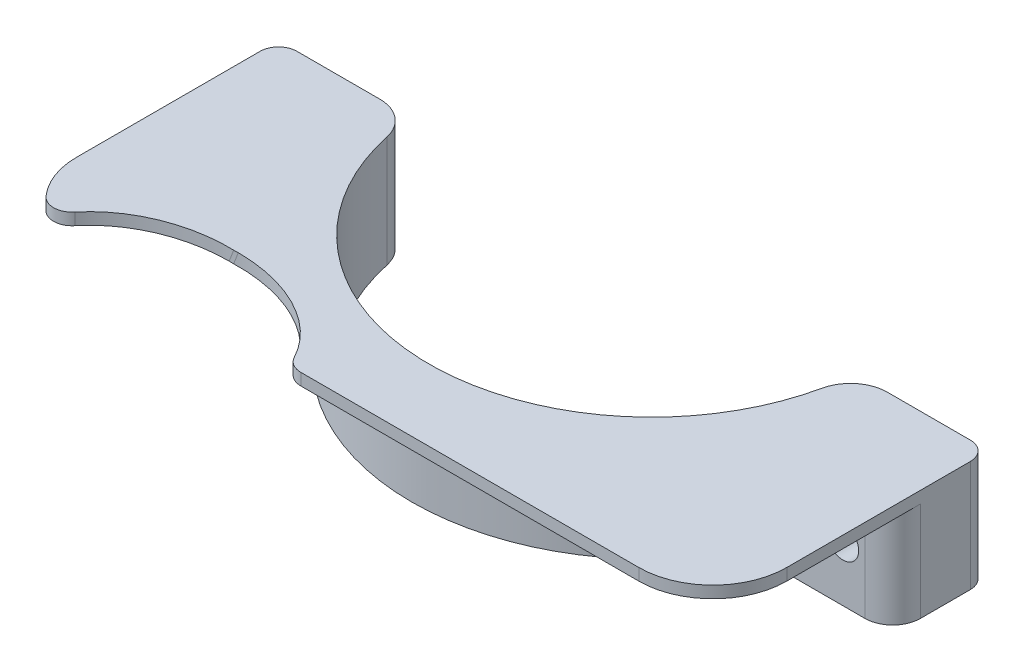
ISO-10303-21;
HEADER;
FILE_DESCRIPTION(('STEP AP214'),'2;1');
FILE_NAME('part.step','',(''),(''),'','','');
FILE_SCHEMA(('AUTOMOTIVE_DESIGN { 1 0 10303 214 1 1 1 1 }'));
ENDSEC;
DATA;
#1=APPLICATION_CONTEXT('core data for automotive mechanical design processes');
#2=APPLICATION_PROTOCOL_DEFINITION('international standard','automotive_design',2000,#1);
#3=PRODUCT_CONTEXT('',#1,'mechanical');
#4=PRODUCT('Part','Part','',(#3));
#5=PRODUCT_RELATED_PRODUCT_CATEGORY('part','',(#4));
#6=PRODUCT_DEFINITION_FORMATION('','',#4);
#7=PRODUCT_DEFINITION_CONTEXT('part definition',#1,'design');
#8=PRODUCT_DEFINITION('design','',#6,#7);
#9=PRODUCT_DEFINITION_SHAPE('','',#8);
#10=(LENGTH_UNIT() NAMED_UNIT(*) SI_UNIT(.MILLI.,.METRE.));
#11=(NAMED_UNIT(*) PLANE_ANGLE_UNIT() SI_UNIT($,.RADIAN.));
#12=(NAMED_UNIT(*) SI_UNIT($,.STERADIAN.) SOLID_ANGLE_UNIT());
#13=UNCERTAINTY_MEASURE_WITH_UNIT(LENGTH_MEASURE(1.E-05),#10,'distance_accuracy_value','');
#14=(GEOMETRIC_REPRESENTATION_CONTEXT(3) GLOBAL_UNCERTAINTY_ASSIGNED_CONTEXT((#13)) GLOBAL_UNIT_ASSIGNED_CONTEXT((#10,
#11,#12)) REPRESENTATION_CONTEXT('',''));
#15=CARTESIAN_POINT('',(0.,0.,0.));
#16=DIRECTION('',(0.,0.,1.));
#17=DIRECTION('',(1.,0.,0.));
#18=AXIS2_PLACEMENT_3D('',#15,#16,#17);
#19=CARTESIAN_POINT('',(1612.138,154.051600930678,-124.642988708345));
#20=DIRECTION('',(0.,0.,-1.));
#21=DIRECTION('',(-1.,0.,0.));
#22=AXIS2_PLACEMENT_3D('',#19,#20,#21);
#23=PLANE('',#22);
#24=DIRECTION('',(-1.,0.,0.));
#25=VECTOR('',#24,1.);
#26=CARTESIAN_POINT('',(1612.138,163.576600930678,-124.642988708345));
#27=LINE('',#26,#25);
#28=CARTESIAN_POINT('',(1605.788,163.576600930678,-124.642988708345));
#29=VERTEX_POINT('',#28);
#30=CARTESIAN_POINT('',(1576.78248811507,163.576600930678,-124.642988708345));
#31=VERTEX_POINT('',#30);
#32=EDGE_CURVE('E285',#29,#31,#27,.T.);
#33=ORIENTED_EDGE('',*,*,#32,.T.);
#34=DIRECTION('',(0.,-1.,0.));
#35=VECTOR('',#34,1.);
#36=CARTESIAN_POINT('',(1576.78248811507,154.051600930678,-124.642988708345));
#37=LINE('',#36,#35);
#38=CARTESIAN_POINT('',(1576.78248811507,162.560600930678,-124.642988708345));
#39=VERTEX_POINT('',#38);
#40=EDGE_CURVE('E219',#31,#39,#37,.T.);
#41=ORIENTED_EDGE('',*,*,#40,.T.);
#42=DIRECTION('',(-1.,0.,0.));
#43=VECTOR('',#42,1.);
#44=CARTESIAN_POINT('',(1581.658,162.560600930678,-124.642988708345));
#45=LINE('',#44,#43);
#46=CARTESIAN_POINT('',(1605.788,162.560600930678,-124.642988708345));
#47=VERTEX_POINT('',#46);
#48=EDGE_CURVE('E246',#47,#39,#45,.T.);
#49=ORIENTED_EDGE('',*,*,#48,.F.);
#50=DIRECTION('',(0.,1.,0.));
#51=VECTOR('',#50,1.);
#52=CARTESIAN_POINT('',(1605.788,163.576600930678,-124.642988708345));
#53=LINE('',#52,#51);
#54=EDGE_CURVE('E337',#47,#29,#53,.T.);
#55=ORIENTED_EDGE('',*,*,#54,.T.);
#56=EDGE_LOOP('',(#33,#41,#49,#55));
#57=FACE_BOUND('',#56,.T.);
#58=ADVANCED_FACE('F35',(#57),#23,.F.);
#59=CARTESIAN_POINT('',(1557.528,154.051600930678,-130.992988708345));
#60=DIRECTION('',(0.,-1.,0.));
#61=DIRECTION('',(0.,0.,-1.));
#62=AXIS2_PLACEMENT_3D('',#59,#60,#61);
#63=CYLINDRICAL_SURFACE('',#62,6.35);
#64=CARTESIAN_POINT('',(1557.528,162.560600930678,-130.992988708345));
#65=DIRECTION('',(0.,1.,0.));
#66=DIRECTION('',(0.,0.,1.));
#67=AXIS2_PLACEMENT_3D('',#64,#65,#66);
#68=CIRCLE('',#67,6.35);
#69=CARTESIAN_POINT('',(1552.74874703953,162.560600930678,-126.81193128948));
#70=VERTEX_POINT('',#69);
#71=CARTESIAN_POINT('',(1551.178,162.560600930678,-130.992988708345));
#72=VERTEX_POINT('',#71);
#73=EDGE_CURVE('E346',#70,#72,#68,.F.);
#74=ORIENTED_EDGE('',*,*,#73,.F.);
#75=DIRECTION('',(0.,-1.,0.));
#76=VECTOR('',#75,1.);
#77=CARTESIAN_POINT('',(1552.74874703953,154.051600930678,-126.81193128948));
#78=LINE('',#77,#76);
#79=CARTESIAN_POINT('',(1552.74874703953,163.576600930678,-126.81193128948));
#80=VERTEX_POINT('',#79);
#81=EDGE_CURVE('E12',#70,#80,#78,.F.);
#82=ORIENTED_EDGE('',*,*,#81,.T.);
#83=CARTESIAN_POINT('',(1557.528,163.576600930678,-130.992988708345));
#84=DIRECTION('',(0.,1.,0.));
#85=DIRECTION('',(0.,0.,1.));
#86=AXIS2_PLACEMENT_3D('',#83,#84,#85);
#87=CIRCLE('',#86,6.35);
#88=CARTESIAN_POINT('',(1551.178,163.576600930678,-130.992988708345));
#89=VERTEX_POINT('',#88);
#90=EDGE_CURVE('E340',#89,#80,#87,.T.);
#91=ORIENTED_EDGE('',*,*,#90,.F.);
#92=DIRECTION('',(0.,1.,0.));
#93=VECTOR('',#92,1.);
#94=CARTESIAN_POINT('',(1551.178,163.576600930678,-130.992988708345));
#95=LINE('',#94,#93);
#96=EDGE_CURVE('E350',#72,#89,#95,.T.);
#97=ORIENTED_EDGE('',*,*,#96,.F.);
#98=EDGE_LOOP('',(#74,#82,#91,#97));
#99=FACE_BOUND('',#98,.T.);
#100=ADVANCED_FACE('F503',(#99),#63,.T.);
#101=CARTESIAN_POINT('',(1551.178,154.051600930678,-148.336));
#102=DIRECTION('',(0.,0.,-1.));
#103=DIRECTION('',(-1.,0.,0.));
#104=AXIS2_PLACEMENT_3D('',#101,#102,#103);
#105=PLANE('',#104);
#106=CARTESIAN_POINT('',(1555.46425,158.814100930678,-148.336));
#107=DIRECTION('',(0.,0.,-1.));
#108=DIRECTION('',(1.,0.,0.));
#109=AXIS2_PLACEMENT_3D('',#106,#107,#108);
#110=CIRCLE('',#109,1.36525000000017);
#111=CARTESIAN_POINT('',(1556.8295,158.814100930678,-148.336));
#112=VERTEX_POINT('',#111);
#113=EDGE_CURVE('E224',#112,#112,#110,.T.);
#114=ORIENTED_EDGE('',*,*,#113,.F.);
#115=EDGE_LOOP('',(#114));
#116=FACE_BOUND('',#115,.T.);
#117=DIRECTION('',(-1.,0.,0.));
#118=VECTOR('',#117,1.);
#119=CARTESIAN_POINT('',(1551.178,163.576600930678,-148.336));
#120=LINE('',#119,#118);
#121=CARTESIAN_POINT('',(1559.88345833686,163.576600930678,-148.336));
#122=VERTEX_POINT('',#121);
#123=CARTESIAN_POINT('',(1552.7655,163.576600930678,-148.336));
#124=VERTEX_POINT('',#123);
#125=EDGE_CURVE('E262',#122,#124,#120,.T.);
#126=ORIENTED_EDGE('',*,*,#125,.F.);
#127=DIRECTION('',(0.,1.,0.));
#128=VECTOR('',#127,1.);
#129=CARTESIAN_POINT('',(1559.88345833686,154.051600930678,-148.336));
#130=LINE('',#129,#128);
#131=CARTESIAN_POINT('',(1559.88345833686,154.051600930678,-148.336));
#132=VERTEX_POINT('',#131);
#133=EDGE_CURVE('E328',#122,#132,#130,.F.);
#134=ORIENTED_EDGE('',*,*,#133,.T.);
#135=DIRECTION('',(-1.,0.,0.));
#136=VECTOR('',#135,1.);
#137=CARTESIAN_POINT('',(1551.178,154.051600930678,-148.336));
#138=LINE('',#137,#136);
#139=CARTESIAN_POINT('',(1552.7655,154.051600930678,-148.336));
#140=VERTEX_POINT('',#139);
#141=EDGE_CURVE('E271',#132,#140,#138,.T.);
#142=ORIENTED_EDGE('',*,*,#141,.T.);
#143=DIRECTION('',(0.,1.,0.));
#144=VECTOR('',#143,1.);
#145=CARTESIAN_POINT('',(1552.7655,154.051600930678,-148.336));
#146=LINE('',#145,#144);
#147=EDGE_CURVE('E299',#140,#124,#146,.T.);
#148=ORIENTED_EDGE('',*,*,#147,.T.);
#149=EDGE_LOOP('',(#126,#134,#142,#148));
#150=FACE_BOUND('',#149,.T.);
#151=ADVANCED_FACE('F490',(#116,#150),#105,.T.);
#152=CARTESIAN_POINT('',(1581.658,154.051600930678,-149.86));
#153=DIRECTION('',(0.,1.,0.));
#154=DIRECTION('',(0.,0.,1.));
#155=AXIS2_PLACEMENT_3D('',#152,#153,#154);
#156=CYLINDRICAL_SURFACE('',#155,19.1008000000002);
#157=CARTESIAN_POINT('',(1581.658,154.051600930678,-149.86));
#158=DIRECTION('',(0.,-1.,0.));
#159=DIRECTION('',(0.,0.,1.));
#160=AXIS2_PLACEMENT_3D('',#157,#158,#159);
#161=CIRCLE('',#160,19.1008000000002);
#162=CARTESIAN_POINT('',(1600.32898669405,154.051600930678,-145.830754846066));
#163=VERTEX_POINT('',#162);
#164=CARTESIAN_POINT('',(1562.98701330595,154.051600930678,-145.830754846066));
#165=VERTEX_POINT('',#164);
#166=EDGE_CURVE('E282',#163,#165,#161,.T.);
#167=ORIENTED_EDGE('',*,*,#166,.T.);
#168=DIRECTION('',(0.,1.,0.));
#169=VECTOR('',#168,1.);
#170=CARTESIAN_POINT('',(1562.98701330595,154.051600930678,-145.830754846066));
#171=LINE('',#170,#169);
#172=CARTESIAN_POINT('',(1562.98701330595,163.576600930678,-145.830754846066));
#173=VERTEX_POINT('',#172);
#174=EDGE_CURVE('E321',#165,#173,#171,.T.);
#175=ORIENTED_EDGE('',*,*,#174,.T.);
#176=CARTESIAN_POINT('',(1581.658,163.576600930678,-149.86));
#177=DIRECTION('',(0.,-1.,0.));
#178=DIRECTION('',(0.,0.,1.));
#179=AXIS2_PLACEMENT_3D('',#176,#177,#178);
#180=CIRCLE('',#179,19.1008000000002);
#181=CARTESIAN_POINT('',(1600.32898669405,163.576600930678,-145.830754846066));
#182=VERTEX_POINT('',#181);
#183=EDGE_CURVE('E274',#182,#173,#180,.T.);
#184=ORIENTED_EDGE('',*,*,#183,.F.);
#185=DIRECTION('',(0.,1.,0.));
#186=VECTOR('',#185,1.);
#187=CARTESIAN_POINT('',(1600.32898669405,154.051600930678,-145.830754846066));
#188=LINE('',#187,#186);
#189=EDGE_CURVE('E319',#182,#163,#188,.F.);
#190=ORIENTED_EDGE('',*,*,#189,.T.);
#191=EDGE_LOOP('',(#167,#175,#184,#190));
#192=FACE_BOUND('',#191,.T.);
#193=ADVANCED_FACE('F480',(#192),#156,.F.);
#194=CARTESIAN_POINT('',(1600.69790505859,154.051600930678,-148.336));
#195=DIRECTION('',(0.,0.,-1.));
#196=DIRECTION('',(-1.,0.,0.));
#197=AXIS2_PLACEMENT_3D('',#194,#195,#196);
#198=PLANE('',#197);
#199=CARTESIAN_POINT('',(1607.85175,158.814100930678,-148.336));
#200=DIRECTION('',(0.,0.,-1.));
#201=DIRECTION('',(-1.,0.,0.));
#202=AXIS2_PLACEMENT_3D('',#199,#200,#201);
#203=CIRCLE('',#202,1.36525000000017);
#204=CARTESIAN_POINT('',(1606.4865,158.814100930678,-148.336));
#205=VERTEX_POINT('',#204);
#206=EDGE_CURVE('E242',#205,#205,#203,.T.);
#207=ORIENTED_EDGE('',*,*,#206,.F.);
#208=EDGE_LOOP('',(#207));
#209=FACE_BOUND('',#208,.T.);
#210=DIRECTION('',(-1.,0.,0.));
#211=VECTOR('',#210,1.);
#212=CARTESIAN_POINT('',(1600.69790505859,154.051600930678,-148.336));
#213=LINE('',#212,#211);
#214=CARTESIAN_POINT('',(1610.5505,154.051600930678,-148.336));
#215=VERTEX_POINT('',#214);
#216=CARTESIAN_POINT('',(1603.43254166314,154.051600930678,-148.336));
#217=VERTEX_POINT('',#216);
#218=EDGE_CURVE('E279',#215,#217,#213,.T.);
#219=ORIENTED_EDGE('',*,*,#218,.T.);
#220=DIRECTION('',(0.,1.,0.));
#221=VECTOR('',#220,1.);
#222=CARTESIAN_POINT('',(1603.43254166314,154.051600930678,-148.336));
#223=LINE('',#222,#221);
#224=CARTESIAN_POINT('',(1603.43254166314,163.576600930678,-148.336));
#225=VERTEX_POINT('',#224);
#226=EDGE_CURVE('E334',#217,#225,#223,.T.);
#227=ORIENTED_EDGE('',*,*,#226,.T.);
#228=DIRECTION('',(-1.,0.,0.));
#229=VECTOR('',#228,1.);
#230=CARTESIAN_POINT('',(1600.69790505859,163.576600930678,-148.336));
#231=LINE('',#230,#229);
#232=CARTESIAN_POINT('',(1610.5505,163.576600930678,-148.336));
#233=VERTEX_POINT('',#232);
#234=EDGE_CURVE('E292',#233,#225,#231,.T.);
#235=ORIENTED_EDGE('',*,*,#234,.F.);
#236=DIRECTION('',(0.,1.,0.));
#237=VECTOR('',#236,1.);
#238=CARTESIAN_POINT('',(1610.5505,154.051600930678,-148.336));
#239=LINE('',#238,#237);
#240=EDGE_CURVE('E317',#233,#215,#239,.F.);
#241=ORIENTED_EDGE('',*,*,#240,.T.);
#242=EDGE_LOOP('',(#219,#227,#235,#241));
#243=FACE_BOUND('',#242,.T.);
#244=ADVANCED_FACE('F471',(#209,#243),#198,.T.);
#245=CARTESIAN_POINT('',(1612.138,154.051600930678,-148.336));
#246=DIRECTION('',(1.,0.,0.));
#247=DIRECTION('',(0.,0.,-1.));
#248=AXIS2_PLACEMENT_3D('',#245,#246,#247);
#249=PLANE('',#248);
#250=DIRECTION('',(0.,0.,1.));
#251=VECTOR('',#250,1.);
#252=CARTESIAN_POINT('',(1612.138,162.560600930678,-140.081));
#253=LINE('',#252,#251);
#254=CARTESIAN_POINT('',(1612.138,162.560600930678,-142.46225));
#255=VERTEX_POINT('',#254);
#256=CARTESIAN_POINT('',(1612.138,162.560600930678,-130.992988708345));
#257=VERTEX_POINT('',#256);
#258=EDGE_CURVE('E263',#255,#257,#253,.T.);
#259=ORIENTED_EDGE('',*,*,#258,.F.);
#260=DIRECTION('',(0.,-1.,0.));
#261=VECTOR('',#260,1.);
#262=CARTESIAN_POINT('',(1612.138,154.051600930678,-142.46225));
#263=LINE('',#262,#261);
#264=CARTESIAN_POINT('',(1612.138,154.051600930678,-142.46225));
#265=VERTEX_POINT('',#264);
#266=EDGE_CURVE('E387',#255,#265,#263,.T.);
#267=ORIENTED_EDGE('',*,*,#266,.T.);
#268=DIRECTION('',(0.,0.,-1.));
#269=VECTOR('',#268,1.);
#270=CARTESIAN_POINT('',(1612.138,154.051600930678,-148.336));
#271=LINE('',#270,#269);
#272=CARTESIAN_POINT('',(1612.138,154.051600930678,-146.7485));
#273=VERTEX_POINT('',#272);
#274=EDGE_CURVE('E277',#265,#273,#271,.T.);
#275=ORIENTED_EDGE('',*,*,#274,.T.);
#276=DIRECTION('',(0.,1.,0.));
#277=VECTOR('',#276,1.);
#278=CARTESIAN_POINT('',(1612.138,154.051600930678,-146.7485));
#279=LINE('',#278,#277);
#280=CARTESIAN_POINT('',(1612.138,163.576600930678,-146.7485));
#281=VERTEX_POINT('',#280);
#282=EDGE_CURVE('E314',#273,#281,#279,.T.);
#283=ORIENTED_EDGE('',*,*,#282,.T.);
#284=DIRECTION('',(0.,0.,-1.));
#285=VECTOR('',#284,1.);
#286=CARTESIAN_POINT('',(1612.138,163.576600930678,-148.336));
#287=LINE('',#286,#285);
#288=CARTESIAN_POINT('',(1612.138,163.576600930678,-130.992988708345));
#289=VERTEX_POINT('',#288);
#290=EDGE_CURVE('E290',#289,#281,#287,.T.);
#291=ORIENTED_EDGE('',*,*,#290,.F.);
#292=DIRECTION('',(0.,1.,0.));
#293=VECTOR('',#292,1.);
#294=CARTESIAN_POINT('',(1612.138,162.560600930678,-130.992988708345));
#295=LINE('',#294,#293);
#296=EDGE_CURVE('E344',#289,#257,#295,.F.);
#297=ORIENTED_EDGE('',*,*,#296,.T.);
#298=EDGE_LOOP('',(#259,#267,#275,#283,#291,#297));
#299=FACE_BOUND('',#298,.T.);
#300=ADVANCED_FACE('F462',(#299),#249,.T.);
#301=CARTESIAN_POINT('',(1551.178,154.051600930678,-148.336));
#302=DIRECTION('',(-1.,0.,0.));
#303=DIRECTION('',(0.,0.,1.));
#304=AXIS2_PLACEMENT_3D('',#301,#302,#303);
#305=PLANE('',#304);
#306=DIRECTION('',(0.,0.,1.));
#307=VECTOR('',#306,1.);
#308=CARTESIAN_POINT('',(1551.178,154.051600930678,-148.336));
#309=LINE('',#308,#307);
#310=CARTESIAN_POINT('',(1551.178,154.051600930678,-146.7485));
#311=VERTEX_POINT('',#310);
#312=CARTESIAN_POINT('',(1551.178,154.051600930678,-142.46225));
#313=VERTEX_POINT('',#312);
#314=EDGE_CURVE('E273',#311,#313,#309,.T.);
#315=ORIENTED_EDGE('',*,*,#314,.T.);
#316=DIRECTION('',(0.,-1.,0.));
#317=VECTOR('',#316,1.);
#318=CARTESIAN_POINT('',(1551.178,162.560600930678,-142.46225));
#319=LINE('',#318,#317);
#320=CARTESIAN_POINT('',(1551.178,162.560600930678,-142.46225));
#321=VERTEX_POINT('',#320);
#322=EDGE_CURVE('E384',#313,#321,#319,.F.);
#323=ORIENTED_EDGE('',*,*,#322,.T.);
#324=DIRECTION('',(0.,0.,-1.));
#325=VECTOR('',#324,1.);
#326=CARTESIAN_POINT('',(1551.178,162.560600930678,-119.761));
#327=LINE('',#326,#325);
#328=EDGE_CURVE('E260',#72,#321,#327,.T.);
#329=ORIENTED_EDGE('',*,*,#328,.F.);
#330=ORIENTED_EDGE('',*,*,#96,.T.);
#331=DIRECTION('',(0.,0.,1.));
#332=VECTOR('',#331,1.);
#333=CARTESIAN_POINT('',(1551.178,163.576600930678,-148.336));
#334=LINE('',#333,#332);
#335=CARTESIAN_POINT('',(1551.178,163.576600930678,-146.7485));
#336=VERTEX_POINT('',#335);
#337=EDGE_CURVE('E287',#336,#89,#334,.T.);
#338=ORIENTED_EDGE('',*,*,#337,.F.);
#339=DIRECTION('',(0.,1.,0.));
#340=VECTOR('',#339,1.);
#341=CARTESIAN_POINT('',(1551.178,154.051600930678,-146.7485));
#342=LINE('',#341,#340);
#343=EDGE_CURVE('E306',#336,#311,#342,.F.);
#344=ORIENTED_EDGE('',*,*,#343,.T.);
#345=EDGE_LOOP('',(#315,#323,#329,#330,#338,#344));
#346=FACE_BOUND('',#345,.T.);
#347=ADVANCED_FACE('F499',(#346),#305,.T.);
#348=CARTESIAN_POINT('',(1581.658,154.051600930678,-149.86));
#349=DIRECTION('',(0.,1.,0.));
#350=DIRECTION('',(0.,0.,1.));
#351=AXIS2_PLACEMENT_3D('',#348,#349,#350);
#352=PLANE('',#351);
#353=DIRECTION('',(1.,0.,0.));
#354=VECTOR('',#353,1.);
#355=CARTESIAN_POINT('',(1563.55660129714,154.051600930678,-140.081));
#356=LINE('',#355,#354);
#357=CARTESIAN_POINT('',(1553.55925,154.051600930678,-140.081));
#358=VERTEX_POINT('',#357);
#359=CARTESIAN_POINT('',(1561.7530035167,154.051600930678,-140.081));
#360=VERTEX_POINT('',#359);
#361=EDGE_CURVE('E249',#358,#360,#356,.T.);
#362=ORIENTED_EDGE('',*,*,#361,.F.);
#363=CARTESIAN_POINT('',(1553.55925,154.051600930678,-142.46225));
#364=DIRECTION('',(0.,1.,0.));
#365=DIRECTION('',(0.,0.,1.));
#366=AXIS2_PLACEMENT_3D('',#363,#364,#365);
#367=CIRCLE('',#366,2.38125);
#368=EDGE_CURVE('E382',#358,#313,#367,.F.);
#369=ORIENTED_EDGE('',*,*,#368,.T.);
#370=ORIENTED_EDGE('',*,*,#314,.F.);
#371=CARTESIAN_POINT('',(1552.7655,154.051600930678,-146.7485));
#372=DIRECTION('',(0.,1.,0.));
#373=DIRECTION('',(0.,0.,1.));
#374=AXIS2_PLACEMENT_3D('',#371,#372,#373);
#375=CIRCLE('',#374,1.5875);
#376=EDGE_CURVE('E311',#311,#140,#375,.F.);
#377=ORIENTED_EDGE('',*,*,#376,.T.);
#378=ORIENTED_EDGE('',*,*,#141,.F.);
#379=CARTESIAN_POINT('',(1559.88345833686,154.051600930678,-145.161));
#380=DIRECTION('',(0.,1.,0.));
#381=DIRECTION('',(0.,0.,1.));
#382=AXIS2_PLACEMENT_3D('',#379,#380,#381);
#383=CIRCLE('',#382,3.175);
#384=EDGE_CURVE('E332',#132,#165,#383,.F.);
#385=ORIENTED_EDGE('',*,*,#384,.T.);
#386=ORIENTED_EDGE('',*,*,#166,.F.);
#387=CARTESIAN_POINT('',(1603.43254166314,154.051600930678,-145.161));
#388=DIRECTION('',(0.,1.,0.));
#389=DIRECTION('',(0.,0.,1.));
#390=AXIS2_PLACEMENT_3D('',#387,#388,#389);
#391=CIRCLE('',#390,3.175);
#392=EDGE_CURVE('E330',#163,#217,#391,.F.);
#393=ORIENTED_EDGE('',*,*,#392,.T.);
#394=ORIENTED_EDGE('',*,*,#218,.F.);
#395=CARTESIAN_POINT('',(1610.5505,154.051600930678,-146.7485));
#396=DIRECTION('',(0.,1.,0.));
#397=DIRECTION('',(0.,0.,1.));
#398=AXIS2_PLACEMENT_3D('',#395,#396,#397);
#399=CIRCLE('',#398,1.5875);
#400=EDGE_CURVE('E308',#215,#273,#399,.F.);
#401=ORIENTED_EDGE('',*,*,#400,.T.);
#402=ORIENTED_EDGE('',*,*,#274,.F.);
#403=CARTESIAN_POINT('',(1609.75675,154.051600930678,-142.46225));
#404=DIRECTION('',(0.,1.,0.));
#405=DIRECTION('',(0.,0.,1.));
#406=AXIS2_PLACEMENT_3D('',#403,#404,#405);
#407=CIRCLE('',#406,2.38125);
#408=CARTESIAN_POINT('',(1609.75675,154.051600930678,-140.081));
#409=VERTEX_POINT('',#408);
#410=EDGE_CURVE('E380',#265,#409,#407,.F.);
#411=ORIENTED_EDGE('',*,*,#410,.T.);
#412=DIRECTION('',(1.,0.,0.));
#413=VECTOR('',#412,1.);
#414=CARTESIAN_POINT('',(1612.138,154.051600930678,-140.081));
#415=LINE('',#414,#413);
#416=CARTESIAN_POINT('',(1601.5629964833,154.051600930678,-140.081));
#417=VERTEX_POINT('',#416);
#418=EDGE_CURVE('E250',#417,#409,#415,.T.);
#419=ORIENTED_EDGE('',*,*,#418,.F.);
#420=CARTESIAN_POINT('',(1601.5629964833,154.051600930678,-136.906));
#421=DIRECTION('',(0.,1.,0.));
#422=DIRECTION('',(0.,0.,1.));
#423=AXIS2_PLACEMENT_3D('',#420,#421,#422);
#424=CIRCLE('',#423,3.175);
#425=CARTESIAN_POINT('',(1598.90190069676,154.051600930678,-138.637818181818));
#426=VERTEX_POINT('',#425);
#427=EDGE_CURVE('E371',#417,#426,#424,.T.);
#428=ORIENTED_EDGE('',*,*,#427,.T.);
#429=CARTESIAN_POINT('',(1581.658,154.051600930678,-149.86));
#430=DIRECTION('',(0.,1.,0.));
#431=DIRECTION('',(0.,0.,-1.));
#432=AXIS2_PLACEMENT_3D('',#429,#430,#431);
#433=CIRCLE('',#432,20.5740000000002);
#434=CARTESIAN_POINT('',(1564.41409930324,154.051600930678,-138.637818181818));
#435=VERTEX_POINT('',#434);
#436=EDGE_CURVE('E254',#435,#426,#433,.T.);
#437=ORIENTED_EDGE('',*,*,#436,.F.);
#438=CARTESIAN_POINT('',(1561.7530035167,154.051600930678,-136.906));
#439=DIRECTION('',(0.,1.,0.));
#440=DIRECTION('',(0.,0.,1.));
#441=AXIS2_PLACEMENT_3D('',#438,#439,#440);
#442=CIRCLE('',#441,3.175);
#443=EDGE_CURVE('E368',#435,#360,#442,.T.);
#444=ORIENTED_EDGE('',*,*,#443,.T.);
#445=EDGE_LOOP('',(#362,#369,#370,#377,#378,#385,#386,#393,#394,#401,#402,#411,#419,#428,#437,#444));
#446=FACE_BOUND('',#445,.T.);
#447=ADVANCED_FACE('F530',(#446),#352,.F.);
#448=CARTESIAN_POINT('',(1581.658,163.576600930678,-149.86));
#449=DIRECTION('',(0.,1.,0.));
#450=DIRECTION('',(0.,0.,1.));
#451=AXIS2_PLACEMENT_3D('',#448,#449,#450);
#452=PLANE('',#451);
#453=CARTESIAN_POINT('',(1565.21348870192,163.576600930678,-122.115720618094));
#454=DIRECTION('',(0.,1.,0.));
#455=DIRECTION('',(-1.,0.,0.));
#456=AXIS2_PLACEMENT_3D('',#453,#454,#455);
#457=ELLIPSE('',#456,11.0210462503366,8.73124999999996);
#458=CARTESIAN_POINT('',(1565.21348870192,163.576600930678,-130.846970618094));
#459=VERTEX_POINT('',#458);
#460=CARTESIAN_POINT('',(1575.37902625167,163.576600930678,-125.488564825466));
#461=VERTEX_POINT('',#460);
#462=EDGE_CURVE('E225',#459,#461,#457,.F.);
#463=ORIENTED_EDGE('',*,*,#462,.T.);
#464=CARTESIAN_POINT('',(1576.78248811507,163.576600930678,-126.230488708345));
#465=DIRECTION('',(0.,1.,0.));
#466=DIRECTION('',(0.,0.,1.));
#467=AXIS2_PLACEMENT_3D('',#464,#465,#466);
#468=CIRCLE('',#467,1.5875);
#469=EDGE_CURVE('E443',#461,#31,#468,.T.);
#470=ORIENTED_EDGE('',*,*,#469,.T.);
#471=ORIENTED_EDGE('',*,*,#32,.F.);
#472=CARTESIAN_POINT('',(1605.788,163.576600930678,-130.992988708345));
#473=DIRECTION('',(0.,1.,0.));
#474=DIRECTION('',(0.,0.,1.));
#475=AXIS2_PLACEMENT_3D('',#472,#473,#474);
#476=CIRCLE('',#475,6.35);
#477=EDGE_CURVE('E342',#29,#289,#476,.T.);
#478=ORIENTED_EDGE('',*,*,#477,.T.);
#479=ORIENTED_EDGE('',*,*,#290,.T.);
#480=CARTESIAN_POINT('',(1610.5505,163.576600930678,-146.7485));
#481=DIRECTION('',(0.,1.,0.));
#482=DIRECTION('',(0.,0.,1.));
#483=AXIS2_PLACEMENT_3D('',#480,#481,#482);
#484=CIRCLE('',#483,1.5875);
#485=EDGE_CURVE('E302',#281,#233,#484,.T.);
#486=ORIENTED_EDGE('',*,*,#485,.T.);
#487=ORIENTED_EDGE('',*,*,#234,.T.);
#488=CARTESIAN_POINT('',(1603.43254166314,163.576600930678,-145.161));
#489=DIRECTION('',(0.,1.,0.));
#490=DIRECTION('',(0.,0.,1.));
#491=AXIS2_PLACEMENT_3D('',#488,#489,#490);
#492=CIRCLE('',#491,3.175);
#493=EDGE_CURVE('E324',#225,#182,#492,.T.);
#494=ORIENTED_EDGE('',*,*,#493,.T.);
#495=ORIENTED_EDGE('',*,*,#183,.T.);
#496=CARTESIAN_POINT('',(1559.88345833686,163.576600930678,-145.161));
#497=DIRECTION('',(0.,1.,0.));
#498=DIRECTION('',(0.,0.,1.));
#499=AXIS2_PLACEMENT_3D('',#496,#497,#498);
#500=CIRCLE('',#499,3.175);
#501=EDGE_CURVE('E326',#173,#122,#500,.T.);
#502=ORIENTED_EDGE('',*,*,#501,.T.);
#503=ORIENTED_EDGE('',*,*,#125,.T.);
#504=CARTESIAN_POINT('',(1552.7655,163.576600930678,-146.7485));
#505=DIRECTION('',(0.,1.,0.));
#506=DIRECTION('',(0.,0.,1.));
#507=AXIS2_PLACEMENT_3D('',#504,#505,#506);
#508=CIRCLE('',#507,1.5875);
#509=EDGE_CURVE('E304',#124,#336,#508,.T.);
#510=ORIENTED_EDGE('',*,*,#509,.T.);
#511=ORIENTED_EDGE('',*,*,#337,.T.);
#512=ORIENTED_EDGE('',*,*,#90,.T.);
#513=CARTESIAN_POINT('',(1553.94356027965,163.576600930678,-127.857195644196));
#514=DIRECTION('',(0.,1.,0.));
#515=DIRECTION('',(0.,0.,1.));
#516=AXIS2_PLACEMENT_3D('',#513,#514,#515);
#517=CIRCLE('',#516,1.5875);
#518=CARTESIAN_POINT('',(1555.1738262858,163.576600930678,-126.853900172212));
#519=VERTEX_POINT('',#518);
#520=EDGE_CURVE('E55',#80,#519,#517,.T.);
#521=ORIENTED_EDGE('',*,*,#520,.T.);
#522=CARTESIAN_POINT('',(1564.43091635106,163.576600930678,-122.115720618094));
#523=DIRECTION('',(0.,-1.,0.));
#524=DIRECTION('',(-1.,0.,0.));
#525=AXIS2_PLACEMENT_3D('',#522,#523,#524);
#526=ELLIPSE('',#525,11.0210462503366,8.73124999999997);
#527=CARTESIAN_POINT('',(1564.82220252649,163.576600930678,-130.841466006151));
#528=VERTEX_POINT('',#527);
#529=EDGE_CURVE('E199',#519,#528,#526,.T.);
#530=ORIENTED_EDGE('',*,*,#529,.T.);
#531=EDGE_CURVE('E204',#528,#459,#457,.F.);
#532=ORIENTED_EDGE('',*,*,#531,.T.);
#533=EDGE_LOOP('',(#463,#470,#471,#478,#479,#486,#487,#494,#495,#502,#503,#510,#511,#512,#521,
#530,#532));
#534=FACE_BOUND('',#533,.T.);
#535=ADVANCED_FACE('F202',(#534),#452,.T.);
#536=CARTESIAN_POINT('',(1581.658,162.560600930678,-149.86));
#537=DIRECTION('',(0.,1.,0.));
#538=DIRECTION('',(0.,0.,1.));
#539=AXIS2_PLACEMENT_3D('',#536,#537,#538);
#540=PLANE('',#539);
#541=ORIENTED_EDGE('',*,*,#48,.T.);
#542=CARTESIAN_POINT('',(1576.78248811507,162.560600930678,-126.230488708345));
#543=DIRECTION('',(0.,1.,0.));
#544=DIRECTION('',(0.,0.,1.));
#545=AXIS2_PLACEMENT_3D('',#542,#543,#544);
#546=CIRCLE('',#545,1.5875);
#547=CARTESIAN_POINT('',(1575.37902625167,162.560600930678,-125.488564825466));
#548=VERTEX_POINT('',#547);
#549=EDGE_CURVE('E435',#39,#548,#546,.F.);
#550=ORIENTED_EDGE('',*,*,#549,.T.);
#551=CARTESIAN_POINT('',(1565.21348870192,162.560600930678,-122.115720618094));
#552=DIRECTION('',(0.,-1.,0.));
#553=DIRECTION('',(-1.,0.,0.));
#554=AXIS2_PLACEMENT_3D('',#551,#552,#553);
#555=ELLIPSE('',#554,11.0210462503366,8.73124999999997);
#556=CARTESIAN_POINT('',(1564.82220252649,162.560600930678,-130.841466006151));
#557=VERTEX_POINT('',#556);
#558=EDGE_CURVE('E209',#557,#548,#555,.T.);
#559=ORIENTED_EDGE('',*,*,#558,.F.);
#560=CARTESIAN_POINT('',(1564.43091635106,162.560600930678,-122.115720618094));
#561=DIRECTION('',(0.,1.,0.));
#562=DIRECTION('',(-1.,0.,0.));
#563=AXIS2_PLACEMENT_3D('',#560,#561,#562);
#564=ELLIPSE('',#563,11.0210462503366,8.73124999999996);
#565=CARTESIAN_POINT('',(1564.43091635106,162.560600930678,-130.846970618094));
#566=VERTEX_POINT('',#565);
#567=EDGE_CURVE('E208',#566,#557,#564,.F.);
#568=ORIENTED_EDGE('',*,*,#567,.F.);
#569=CARTESIAN_POINT('',(1555.1738262858,162.560600930678,-126.853900172212));
#570=VERTEX_POINT('',#569);
#571=EDGE_CURVE('E215',#570,#566,#564,.F.);
#572=ORIENTED_EDGE('',*,*,#571,.F.);
#573=CARTESIAN_POINT('',(1553.94356027965,162.560600930678,-127.857195644196));
#574=DIRECTION('',(0.,1.,0.));
#575=DIRECTION('',(0.,0.,1.));
#576=AXIS2_PLACEMENT_3D('',#573,#574,#575);
#577=CIRCLE('',#576,1.5875);
#578=EDGE_CURVE('E432',#570,#70,#577,.F.);
#579=ORIENTED_EDGE('',*,*,#578,.T.);
#580=ORIENTED_EDGE('',*,*,#73,.T.);
#581=ORIENTED_EDGE('',*,*,#328,.T.);
#582=CARTESIAN_POINT('',(1553.55925,162.560600930678,-142.46225));
#583=DIRECTION('',(0.,1.,0.));
#584=DIRECTION('',(0.,0.,1.));
#585=AXIS2_PLACEMENT_3D('',#582,#583,#584);
#586=CIRCLE('',#585,2.38125);
#587=CARTESIAN_POINT('',(1553.55925,162.560600930678,-140.081));
#588=VERTEX_POINT('',#587);
#589=EDGE_CURVE('E391',#321,#588,#586,.T.);
#590=ORIENTED_EDGE('',*,*,#589,.T.);
#591=DIRECTION('',(1.,0.,0.));
#592=VECTOR('',#591,1.);
#593=CARTESIAN_POINT('',(1563.55660129714,162.560600930678,-140.081));
#594=LINE('',#593,#592);
#595=CARTESIAN_POINT('',(1561.7530035167,162.560600930678,-140.081));
#596=VERTEX_POINT('',#595);
#597=EDGE_CURVE('E253',#588,#596,#594,.T.);
#598=ORIENTED_EDGE('',*,*,#597,.T.);
#599=CARTESIAN_POINT('',(1561.7530035167,162.560600930678,-136.906));
#600=DIRECTION('',(0.,1.,0.));
#601=DIRECTION('',(0.,0.,1.));
#602=AXIS2_PLACEMENT_3D('',#599,#600,#601);
#603=CIRCLE('',#602,3.175);
#604=CARTESIAN_POINT('',(1564.41409930324,162.560600930678,-138.637818181818));
#605=VERTEX_POINT('',#604);
#606=EDGE_CURVE('E363',#596,#605,#603,.F.);
#607=ORIENTED_EDGE('',*,*,#606,.T.);
#608=CARTESIAN_POINT('',(1581.658,162.560600930678,-149.86));
#609=DIRECTION('',(0.,1.,0.));
#610=DIRECTION('',(0.,0.,1.));
#611=AXIS2_PLACEMENT_3D('',#608,#609,#610);
#612=CIRCLE('',#611,20.5740000000002);
#613=CARTESIAN_POINT('',(1598.90190069676,162.560600930678,-138.637818181818));
#614=VERTEX_POINT('',#613);
#615=EDGE_CURVE('E259',#605,#614,#612,.T.);
#616=ORIENTED_EDGE('',*,*,#615,.T.);
#617=CARTESIAN_POINT('',(1601.5629964833,162.560600930678,-136.906));
#618=DIRECTION('',(0.,1.,0.));
#619=DIRECTION('',(0.,0.,1.));
#620=AXIS2_PLACEMENT_3D('',#617,#618,#619);
#621=CIRCLE('',#620,3.175);
#622=CARTESIAN_POINT('',(1601.5629964833,162.560600930678,-140.081));
#623=VERTEX_POINT('',#622);
#624=EDGE_CURVE('E361',#614,#623,#621,.F.);
#625=ORIENTED_EDGE('',*,*,#624,.T.);
#626=DIRECTION('',(1.,0.,0.));
#627=VECTOR('',#626,1.);
#628=CARTESIAN_POINT('',(1612.138,162.560600930678,-140.081));
#629=LINE('',#628,#627);
#630=CARTESIAN_POINT('',(1609.75675,162.560600930678,-140.081));
#631=VERTEX_POINT('',#630);
#632=EDGE_CURVE('E266',#623,#631,#629,.T.);
#633=ORIENTED_EDGE('',*,*,#632,.T.);
#634=CARTESIAN_POINT('',(1609.75675,162.560600930678,-142.46225));
#635=DIRECTION('',(0.,1.,0.));
#636=DIRECTION('',(0.,0.,1.));
#637=AXIS2_PLACEMENT_3D('',#634,#635,#636);
#638=CIRCLE('',#637,2.38125);
#639=EDGE_CURVE('E233',#631,#255,#638,.T.);
#640=ORIENTED_EDGE('',*,*,#639,.T.);
#641=ORIENTED_EDGE('',*,*,#258,.T.);
#642=CARTESIAN_POINT('',(1605.788,162.560600930678,-130.992988708345));
#643=DIRECTION('',(0.,1.,0.));
#644=DIRECTION('',(0.,0.,1.));
#645=AXIS2_PLACEMENT_3D('',#642,#643,#644);
#646=CIRCLE('',#645,6.35);
#647=EDGE_CURVE('E348',#257,#47,#646,.F.);
#648=ORIENTED_EDGE('',*,*,#647,.T.);
#649=EDGE_LOOP('',(#541,#550,#559,#568,#572,#579,#580,#581,#590,#598,#607,#616,#625,#633,#640,
#641,#648));
#650=FACE_BOUND('',#649,.T.);
#651=ADVANCED_FACE('F445',(#650),#540,.F.);
#652=CARTESIAN_POINT('',(1563.55660129714,227.834082985299,-140.081));
#653=DIRECTION('',(0.,0.,-1.));
#654=DIRECTION('',(-1.,0.,0.));
#655=AXIS2_PLACEMENT_3D('',#652,#653,#654);
#656=PLANE('',#655);
#657=CARTESIAN_POINT('',(1555.46425,158.814100930678,-140.081));
#658=DIRECTION('',(0.,0.,-1.));
#659=DIRECTION('',(-1.,0.,0.));
#660=AXIS2_PLACEMENT_3D('',#657,#658,#659);
#661=CIRCLE('',#660,1.36525000000017);
#662=CARTESIAN_POINT('',(1554.099,158.814100930678,-140.081));
#663=VERTEX_POINT('',#662);
#664=EDGE_CURVE('E228',#663,#663,#661,.T.);
#665=ORIENTED_EDGE('',*,*,#664,.T.);
#666=EDGE_LOOP('',(#665));
#667=FACE_BOUND('',#666,.T.);
#668=ORIENTED_EDGE('',*,*,#597,.F.);
#669=DIRECTION('',(0.,-1.,0.));
#670=VECTOR('',#669,1.);
#671=CARTESIAN_POINT('',(1553.55925,154.051600930678,-140.081));
#672=LINE('',#671,#670);
#673=EDGE_CURVE('E373',#588,#358,#672,.T.);
#674=ORIENTED_EDGE('',*,*,#673,.T.);
#675=ORIENTED_EDGE('',*,*,#361,.T.);
#676=DIRECTION('',(0.,1.,0.));
#677=VECTOR('',#676,1.);
#678=CARTESIAN_POINT('',(1561.7530035167,162.560600930678,-140.081));
#679=LINE('',#678,#677);
#680=EDGE_CURVE('E358',#360,#596,#679,.T.);
#681=ORIENTED_EDGE('',*,*,#680,.T.);
#682=EDGE_LOOP('',(#668,#674,#675,#681));
#683=FACE_BOUND('',#682,.T.);
#684=ADVANCED_FACE('F523',(#667,#683),#656,.F.);
#685=CARTESIAN_POINT('',(1581.658,227.834082985299,-149.86));
#686=DIRECTION('',(0.,-1.,0.));
#687=DIRECTION('',(0.,0.,-1.));
#688=AXIS2_PLACEMENT_3D('',#685,#686,#687);
#689=CYLINDRICAL_SURFACE('',#688,20.5740000000002);
#690=ORIENTED_EDGE('',*,*,#615,.F.);
#691=DIRECTION('',(0.,-1.,0.));
#692=VECTOR('',#691,1.);
#693=CARTESIAN_POINT('',(1564.41409930324,227.834082985299,-138.637818181818));
#694=LINE('',#693,#692);
#695=EDGE_CURVE('E355',#605,#435,#694,.T.);
#696=ORIENTED_EDGE('',*,*,#695,.T.);
#697=ORIENTED_EDGE('',*,*,#436,.T.);
#698=DIRECTION('',(0.,-1.,0.));
#699=VECTOR('',#698,1.);
#700=CARTESIAN_POINT('',(1598.90190069676,227.834082985299,-138.637818181818));
#701=LINE('',#700,#699);
#702=EDGE_CURVE('E353',#426,#614,#701,.F.);
#703=ORIENTED_EDGE('',*,*,#702,.T.);
#704=EDGE_LOOP('',(#690,#696,#697,#703));
#705=FACE_BOUND('',#704,.T.);
#706=ADVANCED_FACE('F519',(#705),#689,.T.);
#707=CARTESIAN_POINT('',(1612.138,227.834082985299,-140.081));
#708=DIRECTION('',(0.,0.,-1.));
#709=DIRECTION('',(-1.,0.,0.));
#710=AXIS2_PLACEMENT_3D('',#707,#708,#709);
#711=PLANE('',#710);
#712=CARTESIAN_POINT('',(1607.85175,158.814100930678,-140.081));
#713=DIRECTION('',(0.,0.,-1.));
#714=DIRECTION('',(-1.,0.,0.));
#715=AXIS2_PLACEMENT_3D('',#712,#713,#714);
#716=CIRCLE('',#715,1.36525000000017);
#717=CARTESIAN_POINT('',(1606.4865,158.814100930678,-140.081));
#718=VERTEX_POINT('',#717);
#719=EDGE_CURVE('E245',#718,#718,#716,.T.);
#720=ORIENTED_EDGE('',*,*,#719,.T.);
#721=EDGE_LOOP('',(#720));
#722=FACE_BOUND('',#721,.T.);
#723=ORIENTED_EDGE('',*,*,#418,.T.);
#724=DIRECTION('',(0.,-1.,0.));
#725=VECTOR('',#724,1.);
#726=CARTESIAN_POINT('',(1609.75675,162.560600930678,-140.081));
#727=LINE('',#726,#725);
#728=EDGE_CURVE('E390',#409,#631,#727,.F.);
#729=ORIENTED_EDGE('',*,*,#728,.T.);
#730=ORIENTED_EDGE('',*,*,#632,.F.);
#731=DIRECTION('',(0.,1.,0.));
#732=VECTOR('',#731,1.);
#733=CARTESIAN_POINT('',(1601.5629964833,154.051600930678,-140.081));
#734=LINE('',#733,#732);
#735=EDGE_CURVE('E365',#623,#417,#734,.F.);
#736=ORIENTED_EDGE('',*,*,#735,.T.);
#737=EDGE_LOOP('',(#723,#729,#730,#736));
#738=FACE_BOUND('',#737,.T.);
#739=ADVANCED_FACE('F516',(#722,#738),#711,.F.);
#740=CARTESIAN_POINT('',(1552.7655,154.051600930678,-146.7485));
#741=DIRECTION('',(0.,1.,0.));
#742=DIRECTION('',(0.,0.,1.));
#743=AXIS2_PLACEMENT_3D('',#740,#741,#742);
#744=CYLINDRICAL_SURFACE('',#743,1.5875);
#745=ORIENTED_EDGE('',*,*,#376,.F.);
#746=ORIENTED_EDGE('',*,*,#343,.F.);
#747=ORIENTED_EDGE('',*,*,#509,.F.);
#748=ORIENTED_EDGE('',*,*,#147,.F.);
#749=EDGE_LOOP('',(#745,#746,#747,#748));
#750=FACE_BOUND('',#749,.T.);
#751=ADVANCED_FACE('F495',(#750),#744,.T.);
#752=CARTESIAN_POINT('',(1610.5505,154.051600930678,-146.7485));
#753=DIRECTION('',(0.,1.,0.));
#754=DIRECTION('',(0.,0.,1.));
#755=AXIS2_PLACEMENT_3D('',#752,#753,#754);
#756=CYLINDRICAL_SURFACE('',#755,1.5875);
#757=ORIENTED_EDGE('',*,*,#400,.F.);
#758=ORIENTED_EDGE('',*,*,#240,.F.);
#759=ORIENTED_EDGE('',*,*,#485,.F.);
#760=ORIENTED_EDGE('',*,*,#282,.F.);
#761=EDGE_LOOP('',(#757,#758,#759,#760));
#762=FACE_BOUND('',#761,.T.);
#763=ADVANCED_FACE('F467',(#762),#756,.T.);
#764=CARTESIAN_POINT('',(1559.88345833686,154.051600930678,-145.161));
#765=DIRECTION('',(0.,1.,0.));
#766=DIRECTION('',(0.,0.,1.));
#767=AXIS2_PLACEMENT_3D('',#764,#765,#766);
#768=CYLINDRICAL_SURFACE('',#767,3.175);
#769=ORIENTED_EDGE('',*,*,#384,.F.);
#770=ORIENTED_EDGE('',*,*,#133,.F.);
#771=ORIENTED_EDGE('',*,*,#501,.F.);
#772=ORIENTED_EDGE('',*,*,#174,.F.);
#773=EDGE_LOOP('',(#769,#770,#771,#772));
#774=FACE_BOUND('',#773,.T.);
#775=ADVANCED_FACE('F485',(#774),#768,.T.);
#776=CARTESIAN_POINT('',(1603.43254166314,154.051600930678,-145.161));
#777=DIRECTION('',(0.,1.,0.));
#778=DIRECTION('',(0.,0.,1.));
#779=AXIS2_PLACEMENT_3D('',#776,#777,#778);
#780=CYLINDRICAL_SURFACE('',#779,3.175);
#781=ORIENTED_EDGE('',*,*,#392,.F.);
#782=ORIENTED_EDGE('',*,*,#189,.F.);
#783=ORIENTED_EDGE('',*,*,#493,.F.);
#784=ORIENTED_EDGE('',*,*,#226,.F.);
#785=EDGE_LOOP('',(#781,#782,#783,#784));
#786=FACE_BOUND('',#785,.T.);
#787=ADVANCED_FACE('F476',(#786),#780,.T.);
#788=CARTESIAN_POINT('',(1605.788,154.051600930678,-130.992988708345));
#789=DIRECTION('',(0.,-1.,0.));
#790=DIRECTION('',(0.,0.,-1.));
#791=AXIS2_PLACEMENT_3D('',#788,#789,#790);
#792=CYLINDRICAL_SURFACE('',#791,6.35);
#793=ORIENTED_EDGE('',*,*,#647,.F.);
#794=ORIENTED_EDGE('',*,*,#296,.F.);
#795=ORIENTED_EDGE('',*,*,#477,.F.);
#796=ORIENTED_EDGE('',*,*,#54,.F.);
#797=EDGE_LOOP('',(#793,#794,#795,#796));
#798=FACE_BOUND('',#797,.T.);
#799=ADVANCED_FACE('F457',(#798),#792,.T.);
#800=CARTESIAN_POINT('',(1561.7530035167,227.834082985299,-136.906));
#801=DIRECTION('',(0.,-1.,0.));
#802=DIRECTION('',(0.,0.,-1.));
#803=AXIS2_PLACEMENT_3D('',#800,#801,#802);
#804=CYLINDRICAL_SURFACE('',#803,3.175);
#805=ORIENTED_EDGE('',*,*,#606,.F.);
#806=ORIENTED_EDGE('',*,*,#680,.F.);
#807=ORIENTED_EDGE('',*,*,#443,.F.);
#808=ORIENTED_EDGE('',*,*,#695,.F.);
#809=EDGE_LOOP('',(#805,#806,#807,#808));
#810=FACE_BOUND('',#809,.T.);
#811=ADVANCED_FACE('F557',(#810),#804,.F.);
#812=CARTESIAN_POINT('',(1601.5629964833,227.834082985299,-136.906));
#813=DIRECTION('',(0.,-1.,0.));
#814=DIRECTION('',(0.,0.,-1.));
#815=AXIS2_PLACEMENT_3D('',#812,#813,#814);
#816=CYLINDRICAL_SURFACE('',#815,3.175);
#817=ORIENTED_EDGE('',*,*,#624,.F.);
#818=ORIENTED_EDGE('',*,*,#702,.F.);
#819=ORIENTED_EDGE('',*,*,#427,.F.);
#820=ORIENTED_EDGE('',*,*,#735,.F.);
#821=EDGE_LOOP('',(#817,#818,#819,#820));
#822=FACE_BOUND('',#821,.T.);
#823=ADVANCED_FACE('F561',(#822),#816,.F.);
#824=CARTESIAN_POINT('',(1607.85175,158.814100930678,-124.642988708345));
#825=DIRECTION('',(0.,0.,-1.));
#826=DIRECTION('',(-1.,0.,0.));
#827=AXIS2_PLACEMENT_3D('',#824,#825,#826);
#828=CYLINDRICAL_SURFACE('',#827,1.36525000000017);
#829=ORIENTED_EDGE('',*,*,#206,.T.);
#830=EDGE_LOOP('',(#829));
#831=FACE_BOUND('',#830,.T.);
#832=ORIENTED_EDGE('',*,*,#719,.F.);
#833=EDGE_LOOP('',(#832));
#834=FACE_BOUND('',#833,.T.);
#835=ADVANCED_FACE('F515',(#831,#834),#828,.F.);
#836=CARTESIAN_POINT('',(1555.46425,158.814100930678,-124.642988708345));
#837=DIRECTION('',(0.,0.,-1.));
#838=DIRECTION('',(-1.,0.,0.));
#839=AXIS2_PLACEMENT_3D('',#836,#837,#838);
#840=CYLINDRICAL_SURFACE('',#839,1.36525000000017);
#841=ORIENTED_EDGE('',*,*,#113,.T.);
#842=EDGE_LOOP('',(#841));
#843=FACE_BOUND('',#842,.T.);
#844=ORIENTED_EDGE('',*,*,#664,.F.);
#845=EDGE_LOOP('',(#844));
#846=FACE_BOUND('',#845,.T.);
#847=ADVANCED_FACE('F419',(#843,#846),#840,.F.);
#848=CARTESIAN_POINT('',(1553.55925,227.834082985299,-142.46225));
#849=DIRECTION('',(0.,1.,0.));
#850=DIRECTION('',(0.,0.,1.));
#851=AXIS2_PLACEMENT_3D('',#848,#849,#850);
#852=CYLINDRICAL_SURFACE('',#851,2.38125);
#853=ORIENTED_EDGE('',*,*,#589,.F.);
#854=ORIENTED_EDGE('',*,*,#322,.F.);
#855=ORIENTED_EDGE('',*,*,#368,.F.);
#856=ORIENTED_EDGE('',*,*,#673,.F.);
#857=EDGE_LOOP('',(#853,#854,#855,#856));
#858=FACE_BOUND('',#857,.T.);
#859=ADVANCED_FACE('F566',(#858),#852,.T.);
#860=CARTESIAN_POINT('',(1609.75675,154.051600930678,-142.46225));
#861=DIRECTION('',(0.,1.,0.));
#862=DIRECTION('',(0.,0.,1.));
#863=AXIS2_PLACEMENT_3D('',#860,#861,#862);
#864=CYLINDRICAL_SURFACE('',#863,2.38125);
#865=ORIENTED_EDGE('',*,*,#639,.F.);
#866=ORIENTED_EDGE('',*,*,#728,.F.);
#867=ORIENTED_EDGE('',*,*,#410,.F.);
#868=ORIENTED_EDGE('',*,*,#266,.F.);
#869=EDGE_LOOP('',(#865,#866,#867,#868));
#870=FACE_BOUND('',#869,.T.);
#871=ADVANCED_FACE('F416',(#870),#864,.T.);
#872=CARTESIAN_POINT('',(1582.68653143016,186.261546791979,-122.115720618094));
#873=DIRECTION('',(-0.61021712344484,-0.792234221840174,0.));
#874=DIRECTION('',(0.792234221840174,-0.61021712344484,0.));
#875=AXIS2_PLACEMENT_3D('',#872,#873,#874);
#876=CYLINDRICAL_SURFACE('',#875,8.73124999999996);
#877=CARTESIAN_POINT('',(1564.82220252649,163.576600930677,-130.841466006151));
#878=CARTESIAN_POINT('',(1564.69566175598,163.248029591037,-130.845026419994));
#879=CARTESIAN_POINT('',(1564.56911932278,162.919453934144,-130.846859662122));
#880=CARTESIAN_POINT('',(1564.43868893653,162.580782954295,-130.846968990059));
#881=CARTESIAN_POINT('',(1564.43480264458,162.570691944523,-130.846970618579));
#882=CARTESIAN_POINT('',(1564.43091635106,162.560600930678,-130.846970618094));
#883=B_SPLINE_CURVE_WITH_KNOTS('',3,(#877,#878,#879,#880,#881,#882),.UNSPECIFIED.,.F.,.F.,(4,2,
4),(0.,1.05631661650633,1.08875711147759),.UNSPECIFIED.);
#884=EDGE_CURVE('E212',#566,#528,#883,.F.);
#885=ORIENTED_EDGE('',*,*,#884,.F.);
#886=ORIENTED_EDGE('',*,*,#567,.T.);
#887=CARTESIAN_POINT('',(1564.82220252649,162.560600930678,-130.841466006151));
#888=CARTESIAN_POINT('',(1564.94874329701,162.889172270315,-130.845026419994));
#889=CARTESIAN_POINT('',(1565.0752857302,163.217747927209,-130.846859662122));
#890=CARTESIAN_POINT('',(1565.20571611646,163.55641890706,-130.846968990059));
#891=CARTESIAN_POINT('',(1565.20960240841,163.566509916833,-130.846970618579));
#892=CARTESIAN_POINT('',(1565.21348870192,163.576600930678,-130.846970618094));
#893=B_SPLINE_CURVE_WITH_KNOTS('',3,(#887,#888,#889,#890,#891,#892),.UNSPECIFIED.,.F.,.F.,(4,2,
4),(0.,1.05631661650784,1.08875711147907),.UNSPECIFIED.);
#894=EDGE_CURVE('E220',#459,#557,#893,.F.);
#895=ORIENTED_EDGE('',*,*,#894,.F.);
#896=ORIENTED_EDGE('',*,*,#531,.F.);
#897=EDGE_LOOP('',(#885,#886,#895,#896));
#898=FACE_BOUND('',#897,.T.);
#899=ADVANCED_FACE('F223',(#898),#876,.F.);
#900=DIRECTION('',(0.,-1.,0.));
#901=VECTOR('',#900,1.);
#902=SURFACE_OF_LINEAR_EXTRUSION('',#526,#901);
#903=ORIENTED_EDGE('',*,*,#529,.F.);
#904=DIRECTION('',(0.,-1.,0.));
#905=VECTOR('',#904,1.);
#906=CARTESIAN_POINT('',(1555.1738262858,163.576600930678,-126.853900172212));
#907=LINE('',#906,#905);
#908=EDGE_CURVE('E43',#519,#570,#907,.T.);
#909=ORIENTED_EDGE('',*,*,#908,.T.);
#910=ORIENTED_EDGE('',*,*,#571,.T.);
#911=ORIENTED_EDGE('',*,*,#884,.T.);
#912=EDGE_LOOP('',(#903,#909,#910,#911));
#913=FACE_BOUND('',#912,.T.);
#914=ADVANCED_FACE('F213',(#913),#902,.F.);
#915=CARTESIAN_POINT('',(1565.21348870192,163.576600930678,-122.115720618094));
#916=DIRECTION('',(0.,-1.,0.));
#917=DIRECTION('',(-1.,0.,0.));
#918=AXIS2_PLACEMENT_3D('',#915,#916,#917);
#919=ELLIPSE('',#918,11.0210462503366,8.73124999999997);
#920=DIRECTION('',(0.,-1.,0.));
#921=VECTOR('',#920,1.);
#922=SURFACE_OF_LINEAR_EXTRUSION('',#919,#921);
#923=ORIENTED_EDGE('',*,*,#558,.T.);
#924=DIRECTION('',(0.,-1.,0.));
#925=VECTOR('',#924,1.);
#926=CARTESIAN_POINT('',(1575.37902625167,162.560600930678,-125.488564825466));
#927=LINE('',#926,#925);
#928=EDGE_CURVE('E437',#548,#461,#927,.F.);
#929=ORIENTED_EDGE('',*,*,#928,.T.);
#930=ORIENTED_EDGE('',*,*,#462,.F.);
#931=ORIENTED_EDGE('',*,*,#894,.T.);
#932=EDGE_LOOP('',(#923,#929,#930,#931));
#933=FACE_BOUND('',#932,.T.);
#934=ADVANCED_FACE('F410',(#933),#922,.F.);
#935=CARTESIAN_POINT('',(1576.78248811507,163.068600930678,-126.230488708345));
#936=DIRECTION('',(0.,-1.,0.));
#937=DIRECTION('',(0.,0.,-1.));
#938=AXIS2_PLACEMENT_3D('',#935,#936,#937);
#939=CYLINDRICAL_SURFACE('',#938,1.5875);
#940=ORIENTED_EDGE('',*,*,#469,.F.);
#941=ORIENTED_EDGE('',*,*,#928,.F.);
#942=ORIENTED_EDGE('',*,*,#549,.F.);
#943=ORIENTED_EDGE('',*,*,#40,.F.);
#944=EDGE_LOOP('',(#940,#941,#942,#943));
#945=FACE_BOUND('',#944,.T.);
#946=ADVANCED_FACE('F449',(#945),#939,.T.);
#947=CARTESIAN_POINT('',(1553.94356027965,163.068600930678,-127.857195644196));
#948=DIRECTION('',(0.,-1.,0.));
#949=DIRECTION('',(0.,0.,-1.));
#950=AXIS2_PLACEMENT_3D('',#947,#948,#949);
#951=CYLINDRICAL_SURFACE('',#950,1.5875);
#952=ORIENTED_EDGE('',*,*,#520,.F.);
#953=ORIENTED_EDGE('',*,*,#81,.F.);
#954=ORIENTED_EDGE('',*,*,#578,.F.);
#955=ORIENTED_EDGE('',*,*,#908,.F.);
#956=EDGE_LOOP('',(#952,#953,#954,#955));
#957=FACE_BOUND('',#956,.T.);
#958=ADVANCED_FACE('F37',(#957),#951,.T.);
#959=CLOSED_SHELL('',(#58,#100,#151,#193,#244,#300,#347,#447,#535,#651,#684,#706,#739,#751,#763,
#775,#787,#799,#811,#823,#835,#847,#859,#871,#899,#914,#934,#946,#958));
#960=MANIFOLD_SOLID_BREP('B2',#959);
#961=ADVANCED_BREP_SHAPE_REPRESENTATION('',(#18,#960),#14);
#962=SHAPE_DEFINITION_REPRESENTATION(#9,#961);
ENDSEC;
END-ISO-10303-21;
